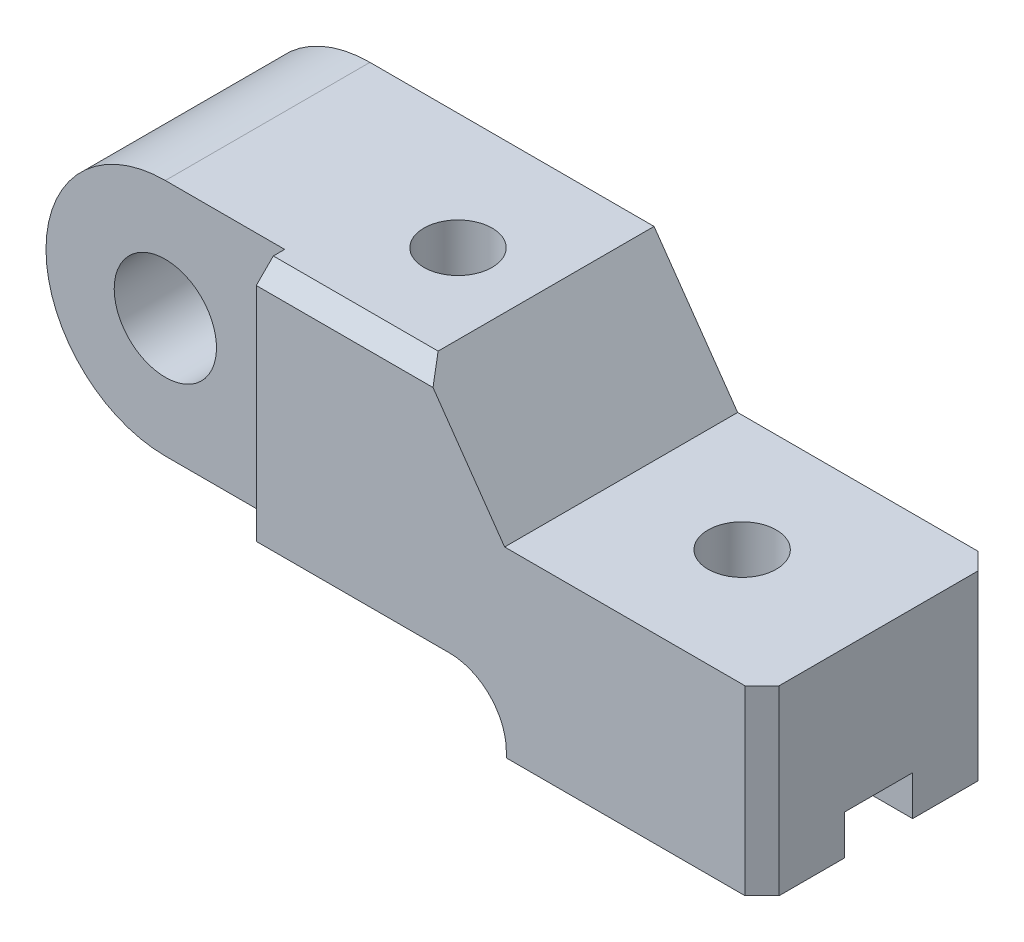
ISO-10303-21;
HEADER;
FILE_DESCRIPTION(('STEP AP214'),'2;1');
FILE_NAME('part.step','',(''),(''),'','','');
FILE_SCHEMA(('AUTOMOTIVE_DESIGN { 1 0 10303 214 1 1 1 1 }'));
ENDSEC;
DATA;
#1=APPLICATION_CONTEXT('core data for automotive mechanical design processes');
#2=APPLICATION_PROTOCOL_DEFINITION('international standard','automotive_design',2000,#1);
#3=PRODUCT_CONTEXT('',#1,'mechanical');
#4=PRODUCT('Part','Part','',(#3));
#5=PRODUCT_RELATED_PRODUCT_CATEGORY('part','',(#4));
#6=PRODUCT_DEFINITION_FORMATION('','',#4);
#7=PRODUCT_DEFINITION_CONTEXT('part definition',#1,'design');
#8=PRODUCT_DEFINITION('design','',#6,#7);
#9=PRODUCT_DEFINITION_SHAPE('','',#8);
#10=(LENGTH_UNIT() NAMED_UNIT(*) SI_UNIT(.MILLI.,.METRE.));
#11=(NAMED_UNIT(*) PLANE_ANGLE_UNIT() SI_UNIT($,.RADIAN.));
#12=(NAMED_UNIT(*) SI_UNIT($,.STERADIAN.) SOLID_ANGLE_UNIT());
#13=UNCERTAINTY_MEASURE_WITH_UNIT(LENGTH_MEASURE(1.E-05),#10,'distance_accuracy_value','');
#14=(GEOMETRIC_REPRESENTATION_CONTEXT(3) GLOBAL_UNCERTAINTY_ASSIGNED_CONTEXT((#13)) GLOBAL_UNIT_ASSIGNED_CONTEXT((#10,
#11,#12)) REPRESENTATION_CONTEXT('',''));
#15=CARTESIAN_POINT('',(0.,0.,0.));
#16=DIRECTION('',(0.,0.,1.));
#17=DIRECTION('',(1.,0.,0.));
#18=AXIS2_PLACEMENT_3D('',#15,#16,#17);
#19=CARTESIAN_POINT('',(0.,-32.,20.5));
#20=DIRECTION('',(0.,-1.,0.));
#21=DIRECTION('',(1.,0.,0.));
#22=AXIS2_PLACEMENT_3D('',#19,#20,#21);
#23=PLANE('',#22);
#24=DIRECTION('',(0.,0.,-1.));
#25=VECTOR('',#24,1.);
#26=CARTESIAN_POINT('',(110.,-32.,20.5));
#27=LINE('',#26,#25);
#28=CARTESIAN_POINT('',(110.,-32.,17.5));
#29=VERTEX_POINT('',#28);
#30=CARTESIAN_POINT('',(110.,-32.,6.));
#31=VERTEX_POINT('',#30);
#32=EDGE_CURVE('E180',#29,#31,#27,.T.);
#33=ORIENTED_EDGE('',*,*,#32,.F.);
#34=DIRECTION('',(0.707106781186551,0.,-0.707106781186544));
#35=VECTOR('',#34,1.);
#36=CARTESIAN_POINT('',(53.4999999999995,-32.,74.));
#37=LINE('',#36,#35);
#38=CARTESIAN_POINT('',(107.,-32.,20.5));
#39=VERTEX_POINT('',#38);
#40=EDGE_CURVE('E328',#29,#39,#37,.F.);
#41=ORIENTED_EDGE('',*,*,#40,.T.);
#42=DIRECTION('',(-1.,0.,0.));
#43=VECTOR('',#42,1.);
#44=CARTESIAN_POINT('',(0.,-32.,20.5));
#45=LINE('',#44,#43);
#46=CARTESIAN_POINT('',(65.,-32.,20.5));
#47=VERTEX_POINT('',#46);
#48=EDGE_CURVE('E254',#39,#47,#45,.T.);
#49=ORIENTED_EDGE('',*,*,#48,.T.);
#50=DIRECTION('',(0.,0.,-1.));
#51=VECTOR('',#50,1.);
#52=CARTESIAN_POINT('',(65.,-32.,20.5));
#53=LINE('',#52,#51);
#54=CARTESIAN_POINT('',(65.,-32.,6.));
#55=VERTEX_POINT('',#54);
#56=EDGE_CURVE('E204',#47,#55,#53,.T.);
#57=ORIENTED_EDGE('',*,*,#56,.T.);
#58=DIRECTION('',(1.,0.,0.));
#59=VECTOR('',#58,1.);
#60=CARTESIAN_POINT('',(55.,-32.,6.));
#61=LINE('',#60,#59);
#62=EDGE_CURVE('E191',#55,#31,#61,.T.);
#63=ORIENTED_EDGE('',*,*,#62,.T.);
#64=EDGE_LOOP('',(#33,#41,#49,#57,#63));
#65=FACE_BOUND('',#64,.T.);
#66=ADVANCED_FACE('F41',(#65),#23,.T.);
#67=CARTESIAN_POINT('',(65.,0.,20.5));
#68=DIRECTION('',(-1.,0.,0.));
#69=DIRECTION('',(0.,0.,1.));
#70=AXIS2_PLACEMENT_3D('',#67,#68,#69);
#71=PLANE('',#70);
#72=DIRECTION('',(0.,1.,0.));
#73=VECTOR('',#72,1.);
#74=CARTESIAN_POINT('',(65.,0.,6.00000000000001));
#75=LINE('',#74,#73);
#76=CARTESIAN_POINT('',(65.,-31.0000000000001,6.));
#77=VERTEX_POINT('',#76);
#78=EDGE_CURVE('E219',#55,#77,#75,.T.);
#79=ORIENTED_EDGE('',*,*,#78,.F.);
#80=ORIENTED_EDGE('',*,*,#56,.F.);
#81=DIRECTION('',(0.,1.,0.));
#82=VECTOR('',#81,1.);
#83=CARTESIAN_POINT('',(65.,0.,20.5));
#84=LINE('',#83,#82);
#85=CARTESIAN_POINT('',(65.,-31.0000000000001,20.5));
#86=VERTEX_POINT('',#85);
#87=EDGE_CURVE('E253',#47,#86,#84,.T.);
#88=ORIENTED_EDGE('',*,*,#87,.T.);
#89=DIRECTION('',(0.,0.,-1.));
#90=VECTOR('',#89,1.);
#91=CARTESIAN_POINT('',(65.,-31.0000000000001,20.5));
#92=LINE('',#91,#90);
#93=EDGE_CURVE('E227',#86,#77,#92,.T.);
#94=ORIENTED_EDGE('',*,*,#93,.T.);
#95=EDGE_LOOP('',(#79,#80,#88,#94));
#96=FACE_BOUND('',#95,.T.);
#97=ADVANCED_FACE('F370',(#96),#71,.T.);
#98=CARTESIAN_POINT('',(55.,-31.,20.5));
#99=DIRECTION('',(0.,0.,-1.));
#100=DIRECTION('',(-1.,0.,0.));
#101=AXIS2_PLACEMENT_3D('',#98,#99,#100);
#102=CYLINDRICAL_SURFACE('',#101,10.);
#103=CARTESIAN_POINT('',(55.,-31.,6.));
#104=DIRECTION('',(0.,0.,1.));
#105=DIRECTION('',(0.,-1.,0.));
#106=AXIS2_PLACEMENT_3D('',#103,#104,#105);
#107=CIRCLE('',#106,10.);
#108=CARTESIAN_POINT('',(63.,-25.,6.));
#109=VERTEX_POINT('',#108);
#110=EDGE_CURVE('E225',#77,#109,#107,.T.);
#111=ORIENTED_EDGE('',*,*,#110,.F.);
#112=ORIENTED_EDGE('',*,*,#93,.F.);
#113=CARTESIAN_POINT('',(55.,-31.,20.5));
#114=DIRECTION('',(0.,0.,1.));
#115=DIRECTION('',(1.,0.,0.));
#116=AXIS2_PLACEMENT_3D('',#113,#114,#115);
#117=CIRCLE('',#116,10.);
#118=CARTESIAN_POINT('',(54.9999999999999,-21.,20.5));
#119=VERTEX_POINT('',#118);
#120=EDGE_CURVE('E247',#86,#119,#117,.T.);
#121=ORIENTED_EDGE('',*,*,#120,.T.);
#122=DIRECTION('',(0.,0.,-1.));
#123=VECTOR('',#122,1.);
#124=CARTESIAN_POINT('',(54.9999999999999,-21.,20.5));
#125=LINE('',#124,#123);
#126=CARTESIAN_POINT('',(54.9999999999999,-21.,-20.5));
#127=VERTEX_POINT('',#126);
#128=EDGE_CURVE('E264',#119,#127,#125,.T.);
#129=ORIENTED_EDGE('',*,*,#128,.T.);
#130=CARTESIAN_POINT('',(55.,-31.,-20.5));
#131=DIRECTION('',(0.,0.,1.));
#132=DIRECTION('',(1.,0.,0.));
#133=AXIS2_PLACEMENT_3D('',#130,#131,#132);
#134=CIRCLE('',#133,10.);
#135=CARTESIAN_POINT('',(65.,-31.0000000000001,-20.5));
#136=VERTEX_POINT('',#135);
#137=EDGE_CURVE('E266',#136,#127,#134,.T.);
#138=ORIENTED_EDGE('',*,*,#137,.F.);
#139=CARTESIAN_POINT('',(65.,-31.0000000000001,-6.));
#140=VERTEX_POINT('',#139);
#141=EDGE_CURVE('E301',#140,#136,#92,.T.);
#142=ORIENTED_EDGE('',*,*,#141,.F.);
#143=CARTESIAN_POINT('',(55.,-31.,-6.));
#144=DIRECTION('',(0.,0.,-1.));
#145=DIRECTION('',(-1.,0.,0.));
#146=AXIS2_PLACEMENT_3D('',#143,#144,#145);
#147=CIRCLE('',#146,10.);
#148=CARTESIAN_POINT('',(63.,-25.,-6.));
#149=VERTEX_POINT('',#148);
#150=EDGE_CURVE('E214',#149,#140,#147,.T.);
#151=ORIENTED_EDGE('',*,*,#150,.F.);
#152=DIRECTION('',(0.,0.,-1.));
#153=VECTOR('',#152,1.);
#154=CARTESIAN_POINT('',(63.,-25.,20.5));
#155=LINE('',#154,#153);
#156=EDGE_CURVE('E217',#109,#149,#155,.T.);
#157=ORIENTED_EDGE('',*,*,#156,.F.);
#158=EDGE_LOOP('',(#111,#112,#121,#129,#138,#142,#151,#157));
#159=FACE_BOUND('',#158,.T.);
#160=ADVANCED_FACE('F371',(#159),#102,.F.);
#161=DIRECTION('',(0.,-1.,0.));
#162=VECTOR('',#161,1.);
#163=CARTESIAN_POINT('',(65.,0.,-6.));
#164=LINE('',#163,#162);
#165=CARTESIAN_POINT('',(65.,-32.,-6.));
#166=VERTEX_POINT('',#165);
#167=EDGE_CURVE('E213',#140,#166,#164,.T.);
#168=ORIENTED_EDGE('',*,*,#167,.F.);
#169=ORIENTED_EDGE('',*,*,#141,.T.);
#170=DIRECTION('',(0.,1.,0.));
#171=VECTOR('',#170,1.);
#172=CARTESIAN_POINT('',(65.,0.,-20.5));
#173=LINE('',#172,#171);
#174=CARTESIAN_POINT('',(65.,-32.,-20.5));
#175=VERTEX_POINT('',#174);
#176=EDGE_CURVE('E267',#175,#136,#173,.T.);
#177=ORIENTED_EDGE('',*,*,#176,.F.);
#178=EDGE_CURVE('E189',#166,#175,#53,.T.);
#179=ORIENTED_EDGE('',*,*,#178,.F.);
#180=EDGE_LOOP('',(#168,#169,#177,#179));
#181=FACE_BOUND('',#180,.T.);
#182=ADVANCED_FACE('F425',(#181),#71,.T.);
#183=DIRECTION('',(-1.,0.,0.));
#184=VECTOR('',#183,1.);
#185=CARTESIAN_POINT('',(0.,-32.,-20.5));
#186=LINE('',#185,#184);
#187=CARTESIAN_POINT('',(107.,-32.,-20.5));
#188=VERTEX_POINT('',#187);
#189=EDGE_CURVE('E272',#188,#175,#186,.T.);
#190=ORIENTED_EDGE('',*,*,#189,.F.);
#191=DIRECTION('',(0.707106781186548,0.,0.707106781186548));
#192=VECTOR('',#191,1.);
#193=CARTESIAN_POINT('',(74.,-32.,-53.5));
#194=LINE('',#193,#192);
#195=CARTESIAN_POINT('',(110.,-32.,-17.5));
#196=VERTEX_POINT('',#195);
#197=EDGE_CURVE('E319',#188,#196,#194,.T.);
#198=ORIENTED_EDGE('',*,*,#197,.T.);
#199=CARTESIAN_POINT('',(110.,-32.,-6.));
#200=VERTEX_POINT('',#199);
#201=EDGE_CURVE('E193',#200,#196,#27,.T.);
#202=ORIENTED_EDGE('',*,*,#201,.F.);
#203=DIRECTION('',(1.,0.,0.));
#204=VECTOR('',#203,1.);
#205=CARTESIAN_POINT('',(55.,-32.,-6.));
#206=LINE('',#205,#204);
#207=EDGE_CURVE('E202',#166,#200,#206,.T.);
#208=ORIENTED_EDGE('',*,*,#207,.F.);
#209=ORIENTED_EDGE('',*,*,#178,.T.);
#210=EDGE_LOOP('',(#190,#198,#202,#208,#209));
#211=FACE_BOUND('',#210,.T.);
#212=ADVANCED_FACE('F416',(#211),#23,.T.);
#213=CARTESIAN_POINT('',(110.,0.,20.5));
#214=DIRECTION('',(1.,0.,0.));
#215=DIRECTION('',(0.,0.,-1.));
#216=AXIS2_PLACEMENT_3D('',#213,#214,#215);
#217=PLANE('',#216);
#218=ORIENTED_EDGE('',*,*,#201,.T.);
#219=DIRECTION('',(0.,1.,0.));
#220=VECTOR('',#219,1.);
#221=CARTESIAN_POINT('',(110.,0.,-17.5));
#222=LINE('',#221,#220);
#223=CARTESIAN_POINT('',(110.,0.,-17.5));
#224=VERTEX_POINT('',#223);
#225=EDGE_CURVE('E323',#196,#224,#222,.T.);
#226=ORIENTED_EDGE('',*,*,#225,.T.);
#227=DIRECTION('',(0.,0.,-1.));
#228=VECTOR('',#227,1.);
#229=CARTESIAN_POINT('',(110.,0.,20.5));
#230=LINE('',#229,#228);
#231=CARTESIAN_POINT('',(110.,0.,17.5));
#232=VERTEX_POINT('',#231);
#233=EDGE_CURVE('E303',#232,#224,#230,.T.);
#234=ORIENTED_EDGE('',*,*,#233,.F.);
#235=DIRECTION('',(0.,-1.,0.));
#236=VECTOR('',#235,1.);
#237=CARTESIAN_POINT('',(110.,0.,17.5));
#238=LINE('',#237,#236);
#239=EDGE_CURVE('E190',#232,#29,#238,.T.);
#240=ORIENTED_EDGE('',*,*,#239,.T.);
#241=ORIENTED_EDGE('',*,*,#32,.T.);
#242=DIRECTION('',(0.,-1.,0.));
#243=VECTOR('',#242,1.);
#244=CARTESIAN_POINT('',(110.,-32.,6.));
#245=LINE('',#244,#243);
#246=CARTESIAN_POINT('',(110.,-25.,6.));
#247=VERTEX_POINT('',#246);
#248=EDGE_CURVE('E184',#247,#31,#245,.T.);
#249=ORIENTED_EDGE('',*,*,#248,.F.);
#250=DIRECTION('',(0.,0.,1.));
#251=VECTOR('',#250,1.);
#252=CARTESIAN_POINT('',(110.,-25.,6.));
#253=LINE('',#252,#251);
#254=CARTESIAN_POINT('',(110.,-25.,-5.99999999999999));
#255=VERTEX_POINT('',#254);
#256=EDGE_CURVE('E206',#255,#247,#253,.T.);
#257=ORIENTED_EDGE('',*,*,#256,.F.);
#258=DIRECTION('',(0.,1.,0.));
#259=VECTOR('',#258,1.);
#260=CARTESIAN_POINT('',(110.,-32.,-6.));
#261=LINE('',#260,#259);
#262=EDGE_CURVE('E199',#200,#255,#261,.T.);
#263=ORIENTED_EDGE('',*,*,#262,.F.);
#264=EDGE_LOOP('',(#218,#226,#234,#240,#241,#249,#257,#263));
#265=FACE_BOUND('',#264,.T.);
#266=ADVANCED_FACE('F185',(#265),#217,.T.);
#267=CARTESIAN_POINT('',(0.,0.,20.5));
#268=DIRECTION('',(0.,1.,0.));
#269=DIRECTION('',(0.,0.,1.));
#270=AXIS2_PLACEMENT_3D('',#267,#268,#269);
#271=PLANE('',#270);
#272=CARTESIAN_POINT('',(86.,0.,0.));
#273=DIRECTION('',(0.,1.,0.));
#274=DIRECTION('',(0.,0.,1.));
#275=AXIS2_PLACEMENT_3D('',#272,#273,#274);
#276=CIRCLE('',#275,6.);
#277=CARTESIAN_POINT('',(86.,0.,6.));
#278=VERTEX_POINT('',#277);
#279=EDGE_CURVE('E269',#278,#278,#276,.T.);
#280=ORIENTED_EDGE('',*,*,#279,.F.);
#281=EDGE_LOOP('',(#280));
#282=FACE_BOUND('',#281,.T.);
#283=ORIENTED_EDGE('',*,*,#233,.T.);
#284=DIRECTION('',(-0.707106781186548,0.,-0.707106781186548));
#285=VECTOR('',#284,1.);
#286=CARTESIAN_POINT('',(74.,0.,-53.5));
#287=LINE('',#286,#285);
#288=CARTESIAN_POINT('',(107.,0.,-20.5));
#289=VERTEX_POINT('',#288);
#290=EDGE_CURVE('E330',#224,#289,#287,.T.);
#291=ORIENTED_EDGE('',*,*,#290,.T.);
#292=DIRECTION('',(1.,0.,0.));
#293=VECTOR('',#292,1.);
#294=CARTESIAN_POINT('',(0.,0.,-20.5));
#295=LINE('',#294,#293);
#296=CARTESIAN_POINT('',(64.704358302404,0.,-20.5));
#297=VERTEX_POINT('',#296);
#298=EDGE_CURVE('E274',#297,#289,#295,.T.);
#299=ORIENTED_EDGE('',*,*,#298,.F.);
#300=DIRECTION('',(0.,0.,-1.));
#301=VECTOR('',#300,1.);
#302=CARTESIAN_POINT('',(64.704358302404,0.,20.5));
#303=LINE('',#302,#301);
#304=CARTESIAN_POINT('',(64.704358302404,0.,20.5));
#305=VERTEX_POINT('',#304);
#306=EDGE_CURVE('E298',#305,#297,#303,.T.);
#307=ORIENTED_EDGE('',*,*,#306,.F.);
#308=DIRECTION('',(1.,0.,0.));
#309=VECTOR('',#308,1.);
#310=CARTESIAN_POINT('',(0.,0.,20.5));
#311=LINE('',#310,#309);
#312=CARTESIAN_POINT('',(107.,0.,20.5));
#313=VERTEX_POINT('',#312);
#314=EDGE_CURVE('E260',#305,#313,#311,.T.);
#315=ORIENTED_EDGE('',*,*,#314,.T.);
#316=DIRECTION('',(-0.707106781186551,0.,0.707106781186544));
#317=VECTOR('',#316,1.);
#318=CARTESIAN_POINT('',(53.4999999999995,0.,74.));
#319=LINE('',#318,#317);
#320=EDGE_CURVE('E324',#313,#232,#319,.F.);
#321=ORIENTED_EDGE('',*,*,#320,.T.);
#322=EDGE_LOOP('',(#283,#291,#299,#307,#315,#321));
#323=FACE_BOUND('',#322,.T.);
#324=ADVANCED_FACE('F402',(#282,#323),#271,.T.);
#325=CARTESIAN_POINT('',(43.4172761013936,30.4011040147284,20.5));
#326=DIRECTION('',(0.819152044288989,0.57357643635105,0.));
#327=DIRECTION('',(-0.57357643635105,0.819152044288989,0.));
#328=AXIS2_PLACEMENT_3D('',#325,#326,#327);
#329=PLANE('',#328);
#330=DIRECTION('',(0.,0.,-1.));
#331=VECTOR('',#330,1.);
#332=CARTESIAN_POINT('',(50.,21.,20.5));
#333=LINE('',#332,#331);
#334=CARTESIAN_POINT('',(50.,21.,17.5));
#335=VERTEX_POINT('',#334);
#336=CARTESIAN_POINT('',(50.,21.,-20.5));
#337=VERTEX_POINT('',#336);
#338=EDGE_CURVE('E300',#335,#337,#333,.T.);
#339=ORIENTED_EDGE('',*,*,#338,.F.);
#340=DIRECTION('',(-0.443712606279663,0.633687274224643,-0.633687274224637));
#341=VECTOR('',#340,1.);
#342=CARTESIAN_POINT('',(46.9041569197247,25.4213221242814,13.0786778757186));
#343=LINE('',#342,#341);
#344=CARTESIAN_POINT('',(52.1006226146291,18.,20.5));
#345=VERTEX_POINT('',#344);
#346=EDGE_CURVE('E49',#335,#345,#343,.F.);
#347=ORIENTED_EDGE('',*,*,#346,.T.);
#348=DIRECTION('',(0.57357643635105,-0.819152044288989,0.));
#349=VECTOR('',#348,1.);
#350=CARTESIAN_POINT('',(43.4172761013936,30.4011040147284,20.5));
#351=LINE('',#350,#349);
#352=EDGE_CURVE('E257',#345,#305,#351,.T.);
#353=ORIENTED_EDGE('',*,*,#352,.T.);
#354=ORIENTED_EDGE('',*,*,#306,.T.);
#355=DIRECTION('',(0.57357643635105,-0.819152044288989,0.));
#356=VECTOR('',#355,1.);
#357=CARTESIAN_POINT('',(43.4172761013936,30.4011040147284,-20.5));
#358=LINE('',#357,#356);
#359=EDGE_CURVE('E279',#337,#297,#358,.T.);
#360=ORIENTED_EDGE('',*,*,#359,.F.);
#361=EDGE_LOOP('',(#339,#347,#353,#354,#360));
#362=FACE_BOUND('',#361,.T.);
#363=ADVANCED_FACE('F338',(#362),#329,.T.);
#364=CARTESIAN_POINT('',(0.,21.,20.5));
#365=DIRECTION('',(0.,1.,0.));
#366=DIRECTION('',(-1.,0.,0.));
#367=AXIS2_PLACEMENT_3D('',#364,#365,#366);
#368=PLANE('',#367);
#369=DIRECTION('',(0.,0.,-1.));
#370=VECTOR('',#369,1.);
#371=CARTESIAN_POINT('',(21.,21.,15.5));
#372=LINE('',#371,#370);
#373=CARTESIAN_POINT('',(21.,21.,17.5));
#374=VERTEX_POINT('',#373);
#375=CARTESIAN_POINT('',(21.,21.,15.5));
#376=VERTEX_POINT('',#375);
#377=EDGE_CURVE('E235',#374,#376,#372,.T.);
#378=ORIENTED_EDGE('',*,*,#377,.F.);
#379=DIRECTION('',(1.,0.,0.));
#380=VECTOR('',#379,1.);
#381=CARTESIAN_POINT('',(0.,21.,17.5));
#382=LINE('',#381,#380);
#383=EDGE_CURVE('E333',#374,#335,#382,.T.);
#384=ORIENTED_EDGE('',*,*,#383,.T.);
#385=ORIENTED_EDGE('',*,*,#338,.T.);
#386=DIRECTION('',(1.,0.,0.));
#387=VECTOR('',#386,1.);
#388=CARTESIAN_POINT('',(0.,21.,-20.5));
#389=LINE('',#388,#387);
#390=CARTESIAN_POINT('',(0.,21.,-20.5));
#391=VERTEX_POINT('',#390);
#392=EDGE_CURVE('E281',#391,#337,#389,.T.);
#393=ORIENTED_EDGE('',*,*,#392,.F.);
#394=DIRECTION('',(0.,0.,-1.));
#395=VECTOR('',#394,1.);
#396=CARTESIAN_POINT('',(0.,21.,20.5));
#397=LINE('',#396,#395);
#398=CARTESIAN_POINT('',(0.,21.,15.5));
#399=VERTEX_POINT('',#398);
#400=EDGE_CURVE('E293',#399,#391,#397,.T.);
#401=ORIENTED_EDGE('',*,*,#400,.F.);
#402=DIRECTION('',(-1.,0.,0.));
#403=VECTOR('',#402,1.);
#404=CARTESIAN_POINT('',(-21.,21.,15.5));
#405=LINE('',#404,#403);
#406=EDGE_CURVE('E233',#376,#399,#405,.T.);
#407=ORIENTED_EDGE('',*,*,#406,.F.);
#408=EDGE_LOOP('',(#378,#384,#385,#393,#401,#407));
#409=FACE_BOUND('',#408,.T.);
#410=CARTESIAN_POINT('',(36.,21.,0.));
#411=DIRECTION('',(0.,1.,0.));
#412=DIRECTION('',(-1.,0.,0.));
#413=AXIS2_PLACEMENT_3D('',#410,#411,#412);
#414=CIRCLE('',#413,5.99999999999999);
#415=CARTESIAN_POINT('',(30.,21.,0.));
#416=VERTEX_POINT('',#415);
#417=EDGE_CURVE('E237',#416,#416,#414,.T.);
#418=ORIENTED_EDGE('',*,*,#417,.F.);
#419=EDGE_LOOP('',(#418));
#420=FACE_BOUND('',#419,.T.);
#421=ADVANCED_FACE('F346',(#409,#420),#368,.T.);
#422=CARTESIAN_POINT('',(0.,0.,20.5));
#423=DIRECTION('',(0.,0.,-1.));
#424=DIRECTION('',(-1.,0.,0.));
#425=AXIS2_PLACEMENT_3D('',#422,#423,#424);
#426=CYLINDRICAL_SURFACE('',#425,21.);
#427=CARTESIAN_POINT('',(0.,0.,15.5));
#428=DIRECTION('',(0.,0.,-1.));
#429=DIRECTION('',(-1.,0.,0.));
#430=AXIS2_PLACEMENT_3D('',#427,#428,#429);
#431=CIRCLE('',#430,21.);
#432=CARTESIAN_POINT('',(0.,-21.,15.5));
#433=VERTEX_POINT('',#432);
#434=EDGE_CURVE('E244',#433,#399,#431,.T.);
#435=ORIENTED_EDGE('',*,*,#434,.T.);
#436=ORIENTED_EDGE('',*,*,#400,.T.);
#437=CARTESIAN_POINT('',(0.,0.,-20.5));
#438=DIRECTION('',(0.,0.,1.));
#439=DIRECTION('',(1.,0.,0.));
#440=AXIS2_PLACEMENT_3D('',#437,#438,#439);
#441=CIRCLE('',#440,21.);
#442=CARTESIAN_POINT('',(0.,-21.,-20.5));
#443=VERTEX_POINT('',#442);
#444=EDGE_CURVE('E283',#391,#443,#441,.T.);
#445=ORIENTED_EDGE('',*,*,#444,.T.);
#446=DIRECTION('',(0.,0.,-1.));
#447=VECTOR('',#446,1.);
#448=CARTESIAN_POINT('',(0.,-21.,20.5));
#449=LINE('',#448,#447);
#450=EDGE_CURVE('E291',#433,#443,#449,.T.);
#451=ORIENTED_EDGE('',*,*,#450,.F.);
#452=EDGE_LOOP('',(#435,#436,#445,#451));
#453=FACE_BOUND('',#452,.T.);
#454=ADVANCED_FACE('F430',(#453),#426,.T.);
#455=CARTESIAN_POINT('',(0.,-21.,20.5));
#456=DIRECTION('',(0.,-1.,0.));
#457=DIRECTION('',(1.,0.,0.));
#458=AXIS2_PLACEMENT_3D('',#455,#456,#457);
#459=PLANE('',#458);
#460=DIRECTION('',(1.,0.,0.));
#461=VECTOR('',#460,1.);
#462=CARTESIAN_POINT('',(0.,-21.,15.5));
#463=LINE('',#462,#461);
#464=CARTESIAN_POINT('',(21.,-21.,15.5));
#465=VERTEX_POINT('',#464);
#466=EDGE_CURVE('E245',#433,#465,#463,.T.);
#467=ORIENTED_EDGE('',*,*,#466,.F.);
#468=ORIENTED_EDGE('',*,*,#450,.T.);
#469=DIRECTION('',(-1.,0.,0.));
#470=VECTOR('',#469,1.);
#471=CARTESIAN_POINT('',(0.,-21.,-20.5));
#472=LINE('',#471,#470);
#473=EDGE_CURVE('E289',#127,#443,#472,.T.);
#474=ORIENTED_EDGE('',*,*,#473,.F.);
#475=ORIENTED_EDGE('',*,*,#128,.F.);
#476=DIRECTION('',(-1.,0.,0.));
#477=VECTOR('',#476,1.);
#478=CARTESIAN_POINT('',(0.,-21.,20.5));
#479=LINE('',#478,#477);
#480=CARTESIAN_POINT('',(21.,-21.,20.5));
#481=VERTEX_POINT('',#480);
#482=EDGE_CURVE('E265',#119,#481,#479,.T.);
#483=ORIENTED_EDGE('',*,*,#482,.T.);
#484=DIRECTION('',(0.,0.,1.));
#485=VECTOR('',#484,1.);
#486=CARTESIAN_POINT('',(21.,-21.,20.5));
#487=LINE('',#486,#485);
#488=EDGE_CURVE('E239',#465,#481,#487,.T.);
#489=ORIENTED_EDGE('',*,*,#488,.F.);
#490=EDGE_LOOP('',(#467,#468,#474,#475,#483,#489));
#491=FACE_BOUND('',#490,.T.);
#492=CARTESIAN_POINT('',(36.,-21.,0.));
#493=DIRECTION('',(0.,-1.,0.));
#494=DIRECTION('',(1.,0.,0.));
#495=AXIS2_PLACEMENT_3D('',#492,#493,#494);
#496=CIRCLE('',#495,5.99999999999999);
#497=CARTESIAN_POINT('',(42.,-21.,0.));
#498=VERTEX_POINT('',#497);
#499=EDGE_CURVE('E249',#498,#498,#496,.T.);
#500=ORIENTED_EDGE('',*,*,#499,.F.);
#501=EDGE_LOOP('',(#500));
#502=FACE_BOUND('',#501,.T.);
#503=ADVANCED_FACE('F356',(#491,#502),#459,.T.);
#504=CARTESIAN_POINT('',(0.,0.,20.5));
#505=DIRECTION('',(0.,0.,-1.));
#506=DIRECTION('',(-1.,0.,0.));
#507=AXIS2_PLACEMENT_3D('',#504,#505,#506);
#508=CYLINDRICAL_SURFACE('',#507,9.);
#509=CARTESIAN_POINT('',(0.,0.,15.5));
#510=DIRECTION('',(0.,0.,-1.));
#511=DIRECTION('',(-1.,0.,0.));
#512=AXIS2_PLACEMENT_3D('',#509,#510,#511);
#513=CIRCLE('',#512,9.);
#514=CARTESIAN_POINT('',(-9.,0.,15.5));
#515=VERTEX_POINT('',#514);
#516=EDGE_CURVE('E241',#515,#515,#513,.T.);
#517=ORIENTED_EDGE('',*,*,#516,.F.);
#518=EDGE_LOOP('',(#517));
#519=FACE_BOUND('',#518,.T.);
#520=CARTESIAN_POINT('',(0.,0.,-20.5));
#521=DIRECTION('',(0.,0.,1.));
#522=DIRECTION('',(1.,0.,0.));
#523=AXIS2_PLACEMENT_3D('',#520,#521,#522);
#524=CIRCLE('',#523,9.);
#525=CARTESIAN_POINT('',(9.,0.,-20.5));
#526=VERTEX_POINT('',#525);
#527=EDGE_CURVE('E252',#526,#526,#524,.T.);
#528=ORIENTED_EDGE('',*,*,#527,.F.);
#529=EDGE_LOOP('',(#528));
#530=FACE_BOUND('',#529,.T.);
#531=ADVANCED_FACE('F495',(#519,#530),#508,.F.);
#532=CARTESIAN_POINT('',(0.,0.,20.5));
#533=DIRECTION('',(0.,0.,1.));
#534=DIRECTION('',(1.,0.,0.));
#535=AXIS2_PLACEMENT_3D('',#532,#533,#534);
#536=PLANE('',#535);
#537=ORIENTED_EDGE('',*,*,#48,.F.);
#538=DIRECTION('',(0.,1.,0.));
#539=VECTOR('',#538,1.);
#540=CARTESIAN_POINT('',(107.,0.,20.5));
#541=LINE('',#540,#539);
#542=EDGE_CURVE('E334',#39,#313,#541,.T.);
#543=ORIENTED_EDGE('',*,*,#542,.T.);
#544=ORIENTED_EDGE('',*,*,#314,.F.);
#545=ORIENTED_EDGE('',*,*,#352,.F.);
#546=DIRECTION('',(-1.,0.,0.));
#547=VECTOR('',#546,1.);
#548=CARTESIAN_POINT('',(0.,18.,20.5));
#549=LINE('',#548,#547);
#550=CARTESIAN_POINT('',(21.,18.,20.5));
#551=VERTEX_POINT('',#550);
#552=EDGE_CURVE('E332',#345,#551,#549,.T.);
#553=ORIENTED_EDGE('',*,*,#552,.T.);
#554=DIRECTION('',(0.,1.,0.));
#555=VECTOR('',#554,1.);
#556=CARTESIAN_POINT('',(21.,-34.,20.5));
#557=LINE('',#556,#555);
#558=EDGE_CURVE('E223',#481,#551,#557,.T.);
#559=ORIENTED_EDGE('',*,*,#558,.F.);
#560=ORIENTED_EDGE('',*,*,#482,.F.);
#561=ORIENTED_EDGE('',*,*,#120,.F.);
#562=ORIENTED_EDGE('',*,*,#87,.F.);
#563=EDGE_LOOP('',(#537,#543,#544,#545,#553,#559,#560,#561,#562));
#564=FACE_BOUND('',#563,.T.);
#565=ADVANCED_FACE('F341',(#564),#536,.T.);
#566=CARTESIAN_POINT('',(0.,0.,-20.5));
#567=DIRECTION('',(0.,0.,1.));
#568=DIRECTION('',(1.,0.,0.));
#569=AXIS2_PLACEMENT_3D('',#566,#567,#568);
#570=PLANE('',#569);
#571=ORIENTED_EDGE('',*,*,#298,.T.);
#572=DIRECTION('',(0.,-1.,0.));
#573=VECTOR('',#572,1.);
#574=CARTESIAN_POINT('',(107.,-32.,-20.5));
#575=LINE('',#574,#573);
#576=EDGE_CURVE('E320',#289,#188,#575,.T.);
#577=ORIENTED_EDGE('',*,*,#576,.T.);
#578=ORIENTED_EDGE('',*,*,#189,.T.);
#579=ORIENTED_EDGE('',*,*,#176,.T.);
#580=ORIENTED_EDGE('',*,*,#137,.T.);
#581=ORIENTED_EDGE('',*,*,#473,.T.);
#582=ORIENTED_EDGE('',*,*,#444,.F.);
#583=ORIENTED_EDGE('',*,*,#392,.T.);
#584=ORIENTED_EDGE('',*,*,#359,.T.);
#585=EDGE_LOOP('',(#571,#577,#578,#579,#580,#581,#582,#583,#584));
#586=FACE_BOUND('',#585,.T.);
#587=ORIENTED_EDGE('',*,*,#527,.T.);
#588=EDGE_LOOP('',(#587));
#589=FACE_BOUND('',#588,.T.);
#590=ADVANCED_FACE('F415',(#586,#589),#570,.F.);
#591=CARTESIAN_POINT('',(-21.,-34.,15.5));
#592=DIRECTION('',(0.,0.,-1.));
#593=DIRECTION('',(-1.,0.,0.));
#594=AXIS2_PLACEMENT_3D('',#591,#592,#593);
#595=PLANE('',#594);
#596=ORIENTED_EDGE('',*,*,#516,.T.);
#597=EDGE_LOOP('',(#596));
#598=FACE_BOUND('',#597,.T.);
#599=ORIENTED_EDGE('',*,*,#434,.F.);
#600=ORIENTED_EDGE('',*,*,#466,.T.);
#601=DIRECTION('',(0.,1.,0.));
#602=VECTOR('',#601,1.);
#603=CARTESIAN_POINT('',(21.,-34.,15.5));
#604=LINE('',#603,#602);
#605=EDGE_CURVE('E221',#465,#376,#604,.T.);
#606=ORIENTED_EDGE('',*,*,#605,.T.);
#607=ORIENTED_EDGE('',*,*,#406,.T.);
#608=EDGE_LOOP('',(#599,#600,#606,#607));
#609=FACE_BOUND('',#608,.T.);
#610=ADVANCED_FACE('F354',(#598,#609),#595,.F.);
#611=CARTESIAN_POINT('',(21.,-34.,15.5));
#612=DIRECTION('',(1.,0.,0.));
#613=DIRECTION('',(0.,1.,0.));
#614=AXIS2_PLACEMENT_3D('',#611,#612,#613);
#615=PLANE('',#614);
#616=ORIENTED_EDGE('',*,*,#558,.T.);
#617=DIRECTION('',(0.,-0.707106781186551,0.707106781186544));
#618=VECTOR('',#617,1.);
#619=CARTESIAN_POINT('',(21.,21.,17.5));
#620=LINE('',#619,#618);
#621=EDGE_CURVE('E11',#551,#374,#620,.F.);
#622=ORIENTED_EDGE('',*,*,#621,.T.);
#623=ORIENTED_EDGE('',*,*,#377,.T.);
#624=ORIENTED_EDGE('',*,*,#605,.F.);
#625=ORIENTED_EDGE('',*,*,#488,.T.);
#626=EDGE_LOOP('',(#616,#622,#623,#624,#625));
#627=FACE_BOUND('',#626,.T.);
#628=ADVANCED_FACE('F352',(#627),#615,.F.);
#629=CARTESIAN_POINT('',(36.,-34.,0.));
#630=DIRECTION('',(0.,1.,0.));
#631=DIRECTION('',(-1.,0.,0.));
#632=AXIS2_PLACEMENT_3D('',#629,#630,#631);
#633=CYLINDRICAL_SURFACE('',#632,5.99999999999999);
#634=ORIENTED_EDGE('',*,*,#499,.T.);
#635=EDGE_LOOP('',(#634));
#636=FACE_BOUND('',#635,.T.);
#637=ORIENTED_EDGE('',*,*,#417,.T.);
#638=EDGE_LOOP('',(#637));
#639=FACE_BOUND('',#638,.T.);
#640=ADVANCED_FACE('F399',(#636,#639),#633,.F.);
#641=CARTESIAN_POINT('',(86.,-34.,0.));
#642=DIRECTION('',(0.,1.,0.));
#643=DIRECTION('',(-1.,0.,0.));
#644=AXIS2_PLACEMENT_3D('',#641,#642,#643);
#645=CYLINDRICAL_SURFACE('',#644,6.);
#646=CARTESIAN_POINT('',(86.,-25.,0.));
#647=DIRECTION('',(0.,1.,0.));
#648=DIRECTION('',(0.,0.,1.));
#649=AXIS2_PLACEMENT_3D('',#646,#647,#648);
#650=CIRCLE('',#649,6.);
#651=CARTESIAN_POINT('',(86.,-25.,-6.));
#652=VERTEX_POINT('',#651);
#653=CARTESIAN_POINT('',(86.,-25.,6.));
#654=VERTEX_POINT('',#653);
#655=EDGE_CURVE('E230',#652,#654,#650,.F.);
#656=ORIENTED_EDGE('',*,*,#655,.T.);
#657=EDGE_CURVE('E316',#654,#652,#650,.F.);
#658=ORIENTED_EDGE('',*,*,#657,.T.);
#659=EDGE_LOOP('',(#656,#658));
#660=FACE_BOUND('',#659,.T.);
#661=ORIENTED_EDGE('',*,*,#279,.T.);
#662=EDGE_LOOP('',(#661));
#663=FACE_BOUND('',#662,.T.);
#664=ADVANCED_FACE('F393',(#660,#663),#645,.F.);
#665=CARTESIAN_POINT('',(55.,-32.,6.));
#666=DIRECTION('',(0.,0.,1.));
#667=DIRECTION('',(0.,-1.,0.));
#668=AXIS2_PLACEMENT_3D('',#665,#666,#667);
#669=PLANE('',#668);
#670=DIRECTION('',(1.,0.,0.));
#671=VECTOR('',#670,1.);
#672=CARTESIAN_POINT('',(55.,-25.,6.));
#673=LINE('',#672,#671);
#674=EDGE_CURVE('E196',#654,#247,#673,.T.);
#675=ORIENTED_EDGE('',*,*,#674,.T.);
#676=ORIENTED_EDGE('',*,*,#248,.T.);
#677=ORIENTED_EDGE('',*,*,#62,.F.);
#678=ORIENTED_EDGE('',*,*,#78,.T.);
#679=ORIENTED_EDGE('',*,*,#110,.T.);
#680=EDGE_CURVE('E216',#109,#654,#673,.T.);
#681=ORIENTED_EDGE('',*,*,#680,.T.);
#682=EDGE_LOOP('',(#675,#676,#677,#678,#679,#681));
#683=FACE_BOUND('',#682,.T.);
#684=ADVANCED_FACE('F195',(#683),#669,.F.);
#685=CARTESIAN_POINT('',(55.,-25.,6.));
#686=DIRECTION('',(0.,1.,0.));
#687=DIRECTION('',(0.,0.,1.));
#688=AXIS2_PLACEMENT_3D('',#685,#686,#687);
#689=PLANE('',#688);
#690=ORIENTED_EDGE('',*,*,#156,.T.);
#691=DIRECTION('',(1.,0.,0.));
#692=VECTOR('',#691,1.);
#693=CARTESIAN_POINT('',(55.,-25.,-6.));
#694=LINE('',#693,#692);
#695=EDGE_CURVE('E377',#149,#652,#694,.T.);
#696=ORIENTED_EDGE('',*,*,#695,.T.);
#697=ORIENTED_EDGE('',*,*,#657,.F.);
#698=ORIENTED_EDGE('',*,*,#680,.F.);
#699=EDGE_LOOP('',(#690,#696,#697,#698));
#700=FACE_BOUND('',#699,.T.);
#701=ADVANCED_FACE('F380',(#700),#689,.F.);
#702=EDGE_CURVE('E208',#652,#255,#694,.T.);
#703=ORIENTED_EDGE('',*,*,#702,.T.);
#704=ORIENTED_EDGE('',*,*,#256,.T.);
#705=ORIENTED_EDGE('',*,*,#674,.F.);
#706=ORIENTED_EDGE('',*,*,#655,.F.);
#707=EDGE_LOOP('',(#703,#704,#705,#706));
#708=FACE_BOUND('',#707,.T.);
#709=ADVANCED_FACE('F395',(#708),#689,.F.);
#710=CARTESIAN_POINT('',(55.,-32.,-6.));
#711=DIRECTION('',(0.,0.,-1.));
#712=DIRECTION('',(-1.,0.,0.));
#713=AXIS2_PLACEMENT_3D('',#710,#711,#712);
#714=PLANE('',#713);
#715=ORIENTED_EDGE('',*,*,#150,.T.);
#716=ORIENTED_EDGE('',*,*,#167,.T.);
#717=ORIENTED_EDGE('',*,*,#207,.T.);
#718=ORIENTED_EDGE('',*,*,#262,.T.);
#719=ORIENTED_EDGE('',*,*,#702,.F.);
#720=ORIENTED_EDGE('',*,*,#695,.F.);
#721=EDGE_LOOP('',(#715,#716,#717,#718,#719,#720));
#722=FACE_BOUND('',#721,.T.);
#723=ADVANCED_FACE('F382',(#722),#714,.F.);
#724=CARTESIAN_POINT('',(107.,0.,-20.5));
#725=DIRECTION('',(0.707106781186548,0.,-0.707106781186548));
#726=DIRECTION('',(0.,1.,0.));
#727=AXIS2_PLACEMENT_3D('',#724,#725,#726);
#728=PLANE('',#727);
#729=ORIENTED_EDGE('',*,*,#290,.F.);
#730=ORIENTED_EDGE('',*,*,#225,.F.);
#731=ORIENTED_EDGE('',*,*,#197,.F.);
#732=ORIENTED_EDGE('',*,*,#576,.F.);
#733=EDGE_LOOP('',(#729,#730,#731,#732));
#734=FACE_BOUND('',#733,.T.);
#735=ADVANCED_FACE('F413',(#734),#728,.T.);
#736=CARTESIAN_POINT('',(110.,0.,17.5));
#737=DIRECTION('',(-0.707106781186544,0.,-0.707106781186551));
#738=DIRECTION('',(0.,-1.,0.));
#739=AXIS2_PLACEMENT_3D('',#736,#737,#738);
#740=PLANE('',#739);
#741=ORIENTED_EDGE('',*,*,#320,.F.);
#742=ORIENTED_EDGE('',*,*,#542,.F.);
#743=ORIENTED_EDGE('',*,*,#40,.F.);
#744=ORIENTED_EDGE('',*,*,#239,.F.);
#745=EDGE_LOOP('',(#741,#742,#743,#744));
#746=FACE_BOUND('',#745,.T.);
#747=ADVANCED_FACE('F429',(#746),#740,.F.);
#748=CARTESIAN_POINT('',(0.,21.,17.5));
#749=DIRECTION('',(0.,-0.707106781186544,-0.707106781186551));
#750=DIRECTION('',(1.,0.,0.));
#751=AXIS2_PLACEMENT_3D('',#748,#749,#750);
#752=PLANE('',#751);
#753=ORIENTED_EDGE('',*,*,#621,.F.);
#754=ORIENTED_EDGE('',*,*,#552,.F.);
#755=ORIENTED_EDGE('',*,*,#346,.F.);
#756=ORIENTED_EDGE('',*,*,#383,.F.);
#757=EDGE_LOOP('',(#753,#754,#755,#756));
#758=FACE_BOUND('',#757,.T.);
#759=ADVANCED_FACE('F42',(#758),#752,.F.);
#760=CLOSED_SHELL('',(#66,#97,#160,#182,#212,#266,#324,#363,#421,#454,#503,#531,#565,#590,#610,
#628,#640,#664,#684,#701,#709,#723,#735,#747,#759));
#761=MANIFOLD_SOLID_BREP('B2',#760);
#762=ADVANCED_BREP_SHAPE_REPRESENTATION('',(#18,#761),#14);
#763=SHAPE_DEFINITION_REPRESENTATION(#9,#762);
ENDSEC;
END-ISO-10303-21;
